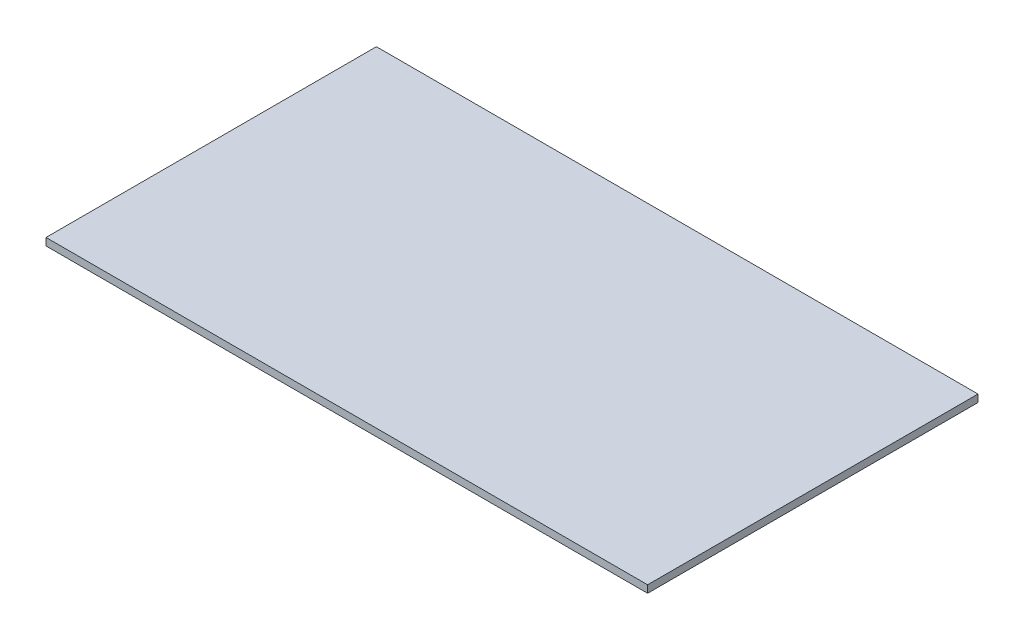
ISO-10303-21;
HEADER;
FILE_DESCRIPTION(('STEP AP214'),'2;1');
FILE_NAME('part.step','',(''),(''),'','','');
FILE_SCHEMA(('AUTOMOTIVE_DESIGN { 1 0 10303 214 1 1 1 1 }'));
ENDSEC;
DATA;
#1=APPLICATION_CONTEXT('core data for automotive mechanical design processes');
#2=APPLICATION_PROTOCOL_DEFINITION('international standard','automotive_design',2000,#1);
#3=PRODUCT_CONTEXT('',#1,'mechanical');
#4=PRODUCT('Part','Part','',(#3));
#5=PRODUCT_RELATED_PRODUCT_CATEGORY('part','',(#4));
#6=PRODUCT_DEFINITION_FORMATION('','',#4);
#7=PRODUCT_DEFINITION_CONTEXT('part definition',#1,'design');
#8=PRODUCT_DEFINITION('design','',#6,#7);
#9=PRODUCT_DEFINITION_SHAPE('','',#8);
#10=(LENGTH_UNIT() NAMED_UNIT(*) SI_UNIT(.MILLI.,.METRE.));
#11=(NAMED_UNIT(*) PLANE_ANGLE_UNIT() SI_UNIT($,.RADIAN.));
#12=(NAMED_UNIT(*) SI_UNIT($,.STERADIAN.) SOLID_ANGLE_UNIT());
#13=UNCERTAINTY_MEASURE_WITH_UNIT(LENGTH_MEASURE(1.E-05),#10,'distance_accuracy_value','');
#14=(GEOMETRIC_REPRESENTATION_CONTEXT(3) GLOBAL_UNCERTAINTY_ASSIGNED_CONTEXT((#13)) GLOBAL_UNIT_ASSIGNED_CONTEXT((#10,
#11,#12)) REPRESENTATION_CONTEXT('',''));
#15=CARTESIAN_POINT('',(0.,0.,0.));
#16=DIRECTION('',(0.,0.,1.));
#17=DIRECTION('',(1.,0.,0.));
#18=AXIS2_PLACEMENT_3D('',#15,#16,#17);
#19=CARTESIAN_POINT('',(-122.,3.,67.));
#20=DIRECTION('',(1.,0.,0.));
#21=DIRECTION('',(0.,0.,-1.));
#22=AXIS2_PLACEMENT_3D('',#19,#20,#21);
#23=PLANE('',#22);
#24=DIRECTION('',(0.,0.,1.));
#25=VECTOR('',#24,1.);
#26=CARTESIAN_POINT('',(-122.,0.,67.));
#27=LINE('',#26,#25);
#28=CARTESIAN_POINT('',(-122.,0.,-67.));
#29=VERTEX_POINT('',#28);
#30=CARTESIAN_POINT('',(-122.,0.,67.));
#31=VERTEX_POINT('',#30);
#32=EDGE_CURVE('E97',#29,#31,#27,.T.);
#33=ORIENTED_EDGE('',*,*,#32,.T.);
#34=DIRECTION('',(0.,-1.,0.));
#35=VECTOR('',#34,1.);
#36=CARTESIAN_POINT('',(-122.,3.,67.));
#37=LINE('',#36,#35);
#38=CARTESIAN_POINT('',(-122.,3.,67.));
#39=VERTEX_POINT('',#38);
#40=EDGE_CURVE('E11',#39,#31,#37,.T.);
#41=ORIENTED_EDGE('',*,*,#40,.F.);
#42=DIRECTION('',(0.,0.,1.));
#43=VECTOR('',#42,1.);
#44=CARTESIAN_POINT('',(-122.,3.,67.));
#45=LINE('',#44,#43);
#46=CARTESIAN_POINT('',(-122.,3.,-67.));
#47=VERTEX_POINT('',#46);
#48=EDGE_CURVE('E85',#47,#39,#45,.T.);
#49=ORIENTED_EDGE('',*,*,#48,.F.);
#50=DIRECTION('',(0.,-1.,0.));
#51=VECTOR('',#50,1.);
#52=CARTESIAN_POINT('',(-122.,3.,-67.));
#53=LINE('',#52,#51);
#54=EDGE_CURVE('E93',#47,#29,#53,.T.);
#55=ORIENTED_EDGE('',*,*,#54,.T.);
#56=EDGE_LOOP('',(#33,#41,#49,#55));
#57=FACE_BOUND('',#56,.T.);
#58=ADVANCED_FACE('F34',(#57),#23,.F.);
#59=CARTESIAN_POINT('',(122.,3.,67.));
#60=DIRECTION('',(0.,0.,-1.));
#61=DIRECTION('',(-1.,0.,0.));
#62=AXIS2_PLACEMENT_3D('',#59,#60,#61);
#63=PLANE('',#62);
#64=DIRECTION('',(1.,0.,0.));
#65=VECTOR('',#64,1.);
#66=CARTESIAN_POINT('',(122.,0.,67.));
#67=LINE('',#66,#65);
#68=CARTESIAN_POINT('',(122.,0.,67.));
#69=VERTEX_POINT('',#68);
#70=EDGE_CURVE('E89',#31,#69,#67,.T.);
#71=ORIENTED_EDGE('',*,*,#70,.T.);
#72=DIRECTION('',(0.,-1.,0.));
#73=VECTOR('',#72,1.);
#74=CARTESIAN_POINT('',(122.,3.,67.));
#75=LINE('',#74,#73);
#76=CARTESIAN_POINT('',(122.,3.,67.));
#77=VERTEX_POINT('',#76);
#78=EDGE_CURVE('E42',#77,#69,#75,.T.);
#79=ORIENTED_EDGE('',*,*,#78,.F.);
#80=DIRECTION('',(1.,0.,0.));
#81=VECTOR('',#80,1.);
#82=CARTESIAN_POINT('',(122.,3.,67.));
#83=LINE('',#82,#81);
#84=EDGE_CURVE('E80',#39,#77,#83,.T.);
#85=ORIENTED_EDGE('',*,*,#84,.F.);
#86=ORIENTED_EDGE('',*,*,#40,.T.);
#87=EDGE_LOOP('',(#71,#79,#85,#86));
#88=FACE_BOUND('',#87,.T.);
#89=ADVANCED_FACE('F88',(#88),#63,.F.);
#90=CARTESIAN_POINT('',(122.,3.,67.));
#91=DIRECTION('',(-1.,0.,0.));
#92=DIRECTION('',(0.,0.,1.));
#93=AXIS2_PLACEMENT_3D('',#90,#91,#92);
#94=PLANE('',#93);
#95=DIRECTION('',(0.,0.,-1.));
#96=VECTOR('',#95,1.);
#97=CARTESIAN_POINT('',(122.,0.,67.));
#98=LINE('',#97,#96);
#99=CARTESIAN_POINT('',(122.,0.,-67.));
#100=VERTEX_POINT('',#99);
#101=EDGE_CURVE('E67',#69,#100,#98,.T.);
#102=ORIENTED_EDGE('',*,*,#101,.T.);
#103=DIRECTION('',(0.,-1.,0.));
#104=VECTOR('',#103,1.);
#105=CARTESIAN_POINT('',(122.,3.,-67.));
#106=LINE('',#105,#104);
#107=CARTESIAN_POINT('',(122.,3.,-67.));
#108=VERTEX_POINT('',#107);
#109=EDGE_CURVE('E90',#108,#100,#106,.T.);
#110=ORIENTED_EDGE('',*,*,#109,.F.);
#111=DIRECTION('',(0.,0.,-1.));
#112=VECTOR('',#111,1.);
#113=CARTESIAN_POINT('',(122.,3.,67.));
#114=LINE('',#113,#112);
#115=EDGE_CURVE('E83',#77,#108,#114,.T.);
#116=ORIENTED_EDGE('',*,*,#115,.F.);
#117=ORIENTED_EDGE('',*,*,#78,.T.);
#118=EDGE_LOOP('',(#102,#110,#116,#117));
#119=FACE_BOUND('',#118,.T.);
#120=ADVANCED_FACE('F91',(#119),#94,.F.);
#121=CARTESIAN_POINT('',(122.,3.,-67.));
#122=DIRECTION('',(0.,0.,1.));
#123=DIRECTION('',(1.,0.,0.));
#124=AXIS2_PLACEMENT_3D('',#121,#122,#123);
#125=PLANE('',#124);
#126=DIRECTION('',(-1.,0.,0.));
#127=VECTOR('',#126,1.);
#128=CARTESIAN_POINT('',(122.,0.,-67.));
#129=LINE('',#128,#127);
#130=EDGE_CURVE('E73',#100,#29,#129,.T.);
#131=ORIENTED_EDGE('',*,*,#130,.T.);
#132=ORIENTED_EDGE('',*,*,#54,.F.);
#133=DIRECTION('',(-1.,0.,0.));
#134=VECTOR('',#133,1.);
#135=CARTESIAN_POINT('',(122.,3.,-67.));
#136=LINE('',#135,#134);
#137=EDGE_CURVE('E50',#108,#47,#136,.T.);
#138=ORIENTED_EDGE('',*,*,#137,.F.);
#139=ORIENTED_EDGE('',*,*,#109,.T.);
#140=EDGE_LOOP('',(#131,#132,#138,#139));
#141=FACE_BOUND('',#140,.T.);
#142=ADVANCED_FACE('F104',(#141),#125,.F.);
#143=CARTESIAN_POINT('',(0.,3.,0.));
#144=DIRECTION('',(0.,1.,0.));
#145=DIRECTION('',(0.,0.,1.));
#146=AXIS2_PLACEMENT_3D('',#143,#144,#145);
#147=PLANE('',#146);
#148=ORIENTED_EDGE('',*,*,#48,.T.);
#149=ORIENTED_EDGE('',*,*,#84,.T.);
#150=ORIENTED_EDGE('',*,*,#115,.T.);
#151=ORIENTED_EDGE('',*,*,#137,.T.);
#152=EDGE_LOOP('',(#148,#149,#150,#151));
#153=FACE_BOUND('',#152,.T.);
#154=ADVANCED_FACE('F81',(#153),#147,.T.);
#155=CARTESIAN_POINT('',(0.,0.,0.));
#156=DIRECTION('',(0.,1.,0.));
#157=DIRECTION('',(0.,0.,1.));
#158=AXIS2_PLACEMENT_3D('',#155,#156,#157);
#159=PLANE('',#158);
#160=ORIENTED_EDGE('',*,*,#32,.F.);
#161=ORIENTED_EDGE('',*,*,#130,.F.);
#162=ORIENTED_EDGE('',*,*,#101,.F.);
#163=ORIENTED_EDGE('',*,*,#70,.F.);
#164=EDGE_LOOP('',(#160,#161,#162,#163));
#165=FACE_BOUND('',#164,.T.);
#166=ADVANCED_FACE('F107',(#165),#159,.F.);
#167=CLOSED_SHELL('',(#58,#89,#120,#142,#154,#166));
#168=MANIFOLD_SOLID_BREP('B2',#167);
#169=ADVANCED_BREP_SHAPE_REPRESENTATION('',(#18,#168),#14);
#170=SHAPE_DEFINITION_REPRESENTATION(#9,#169);
ENDSEC;
END-ISO-10303-21;
